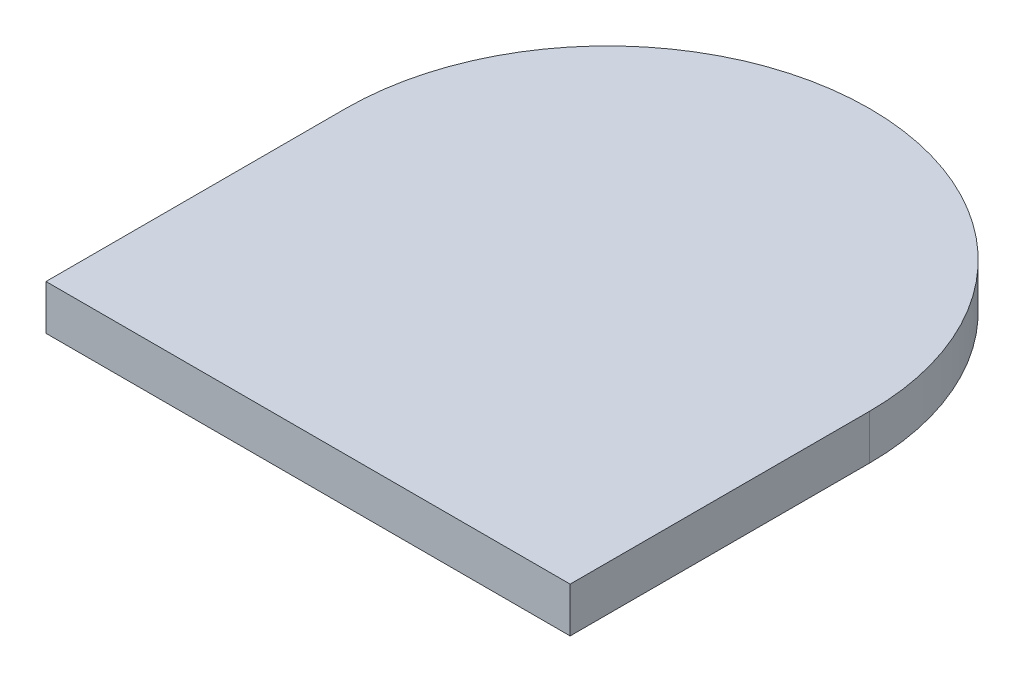
ISO-10303-21;
HEADER;
FILE_DESCRIPTION(('STEP AP214'),'2;1');
FILE_NAME('part.step','',(''),(''),'','','');
FILE_SCHEMA(('AUTOMOTIVE_DESIGN { 1 0 10303 214 1 1 1 1 }'));
ENDSEC;
DATA;
#1=APPLICATION_CONTEXT('core data for automotive mechanical design processes');
#2=APPLICATION_PROTOCOL_DEFINITION('international standard','automotive_design',2000,#1);
#3=PRODUCT_CONTEXT('',#1,'mechanical');
#4=PRODUCT('Part','Part','',(#3));
#5=PRODUCT_RELATED_PRODUCT_CATEGORY('part','',(#4));
#6=PRODUCT_DEFINITION_FORMATION('','',#4);
#7=PRODUCT_DEFINITION_CONTEXT('part definition',#1,'design');
#8=PRODUCT_DEFINITION('design','',#6,#7);
#9=PRODUCT_DEFINITION_SHAPE('','',#8);
#10=(LENGTH_UNIT() NAMED_UNIT(*) SI_UNIT(.MILLI.,.METRE.));
#11=(NAMED_UNIT(*) PLANE_ANGLE_UNIT() SI_UNIT($,.RADIAN.));
#12=(NAMED_UNIT(*) SI_UNIT($,.STERADIAN.) SOLID_ANGLE_UNIT());
#13=UNCERTAINTY_MEASURE_WITH_UNIT(LENGTH_MEASURE(1.E-05),#10,'distance_accuracy_value','');
#14=(GEOMETRIC_REPRESENTATION_CONTEXT(3) GLOBAL_UNCERTAINTY_ASSIGNED_CONTEXT((#13)) GLOBAL_UNIT_ASSIGNED_CONTEXT((#10,
#11,#12)) REPRESENTATION_CONTEXT('',''));
#15=CARTESIAN_POINT('',(0.,0.,0.));
#16=DIRECTION('',(0.,0.,1.));
#17=DIRECTION('',(1.,0.,0.));
#18=AXIS2_PLACEMENT_3D('',#15,#16,#17);
#19=CARTESIAN_POINT('',(0.,3.,0.));
#20=DIRECTION('',(0.,-1.,0.));
#21=DIRECTION('',(0.,0.,-1.));
#22=AXIS2_PLACEMENT_3D('',#19,#20,#21);
#23=CYLINDRICAL_SURFACE('',#22,17.5);
#24=CARTESIAN_POINT('',(0.,0.,0.));
#25=DIRECTION('',(0.,1.,0.));
#26=DIRECTION('',(0.,0.,1.));
#27=AXIS2_PLACEMENT_3D('',#24,#25,#26);
#28=CIRCLE('',#27,17.5);
#29=CARTESIAN_POINT('',(17.5,0.,0.));
#30=VERTEX_POINT('',#29);
#31=CARTESIAN_POINT('',(-17.5,0.,0.));
#32=VERTEX_POINT('',#31);
#33=EDGE_CURVE('E111',#30,#32,#28,.T.);
#34=ORIENTED_EDGE('',*,*,#33,.T.);
#35=DIRECTION('',(0.,-1.,0.));
#36=VECTOR('',#35,1.);
#37=CARTESIAN_POINT('',(-17.5,3.,0.));
#38=LINE('',#37,#36);
#39=CARTESIAN_POINT('',(-17.5,3.,0.));
#40=VERTEX_POINT('',#39);
#41=EDGE_CURVE('E11',#40,#32,#38,.T.);
#42=ORIENTED_EDGE('',*,*,#41,.F.);
#43=CARTESIAN_POINT('',(0.,3.,0.));
#44=DIRECTION('',(0.,1.,0.));
#45=DIRECTION('',(0.,0.,1.));
#46=AXIS2_PLACEMENT_3D('',#43,#44,#45);
#47=CIRCLE('',#46,17.5);
#48=CARTESIAN_POINT('',(17.5,3.,0.));
#49=VERTEX_POINT('',#48);
#50=EDGE_CURVE('E95',#49,#40,#47,.T.);
#51=ORIENTED_EDGE('',*,*,#50,.F.);
#52=DIRECTION('',(0.,-1.,0.));
#53=VECTOR('',#52,1.);
#54=CARTESIAN_POINT('',(17.5,3.,0.));
#55=LINE('',#54,#53);
#56=EDGE_CURVE('E107',#49,#30,#55,.T.);
#57=ORIENTED_EDGE('',*,*,#56,.T.);
#58=EDGE_LOOP('',(#34,#42,#51,#57));
#59=FACE_BOUND('',#58,.T.);
#60=ADVANCED_FACE('F43',(#59),#23,.T.);
#61=CARTESIAN_POINT('',(-17.5,3.,0.));
#62=DIRECTION('',(1.,0.,0.));
#63=DIRECTION('',(0.,0.,-1.));
#64=AXIS2_PLACEMENT_3D('',#61,#62,#63);
#65=PLANE('',#64);
#66=DIRECTION('',(0.,0.,1.));
#67=VECTOR('',#66,1.);
#68=CARTESIAN_POINT('',(-17.5,0.,0.));
#69=LINE('',#68,#67);
#70=CARTESIAN_POINT('',(-17.5,0.,20.));
#71=VERTEX_POINT('',#70);
#72=EDGE_CURVE('E100',#32,#71,#69,.T.);
#73=ORIENTED_EDGE('',*,*,#72,.T.);
#74=DIRECTION('',(0.,-1.,0.));
#75=VECTOR('',#74,1.);
#76=CARTESIAN_POINT('',(-17.5,3.,20.));
#77=LINE('',#76,#75);
#78=CARTESIAN_POINT('',(-17.5,3.,20.));
#79=VERTEX_POINT('',#78);
#80=EDGE_CURVE('E52',#79,#71,#77,.T.);
#81=ORIENTED_EDGE('',*,*,#80,.F.);
#82=DIRECTION('',(0.,0.,1.));
#83=VECTOR('',#82,1.);
#84=CARTESIAN_POINT('',(-17.5,3.,0.));
#85=LINE('',#84,#83);
#86=EDGE_CURVE('E90',#40,#79,#85,.T.);
#87=ORIENTED_EDGE('',*,*,#86,.F.);
#88=ORIENTED_EDGE('',*,*,#41,.T.);
#89=EDGE_LOOP('',(#73,#81,#87,#88));
#90=FACE_BOUND('',#89,.T.);
#91=ADVANCED_FACE('F99',(#90),#65,.F.);
#92=CARTESIAN_POINT('',(-17.5,3.,20.));
#93=DIRECTION('',(0.,0.,-1.));
#94=DIRECTION('',(-1.,0.,0.));
#95=AXIS2_PLACEMENT_3D('',#92,#93,#94);
#96=PLANE('',#95);
#97=DIRECTION('',(1.,0.,0.));
#98=VECTOR('',#97,1.);
#99=CARTESIAN_POINT('',(-17.5,0.,20.));
#100=LINE('',#99,#98);
#101=CARTESIAN_POINT('',(17.5,0.,20.));
#102=VERTEX_POINT('',#101);
#103=EDGE_CURVE('E77',#71,#102,#100,.T.);
#104=ORIENTED_EDGE('',*,*,#103,.T.);
#105=DIRECTION('',(0.,-1.,0.));
#106=VECTOR('',#105,1.);
#107=CARTESIAN_POINT('',(17.5,3.,20.));
#108=LINE('',#107,#106);
#109=CARTESIAN_POINT('',(17.5,3.,20.));
#110=VERTEX_POINT('',#109);
#111=EDGE_CURVE('E102',#110,#102,#108,.T.);
#112=ORIENTED_EDGE('',*,*,#111,.F.);
#113=DIRECTION('',(1.,0.,0.));
#114=VECTOR('',#113,1.);
#115=CARTESIAN_POINT('',(-17.5,3.,20.));
#116=LINE('',#115,#114);
#117=EDGE_CURVE('E93',#79,#110,#116,.T.);
#118=ORIENTED_EDGE('',*,*,#117,.F.);
#119=ORIENTED_EDGE('',*,*,#80,.T.);
#120=EDGE_LOOP('',(#104,#112,#118,#119));
#121=FACE_BOUND('',#120,.T.);
#122=ADVANCED_FACE('F103',(#121),#96,.F.);
#123=CARTESIAN_POINT('',(17.5,3.,20.));
#124=DIRECTION('',(-1.,0.,0.));
#125=DIRECTION('',(0.,0.,1.));
#126=AXIS2_PLACEMENT_3D('',#123,#124,#125);
#127=PLANE('',#126);
#128=DIRECTION('',(0.,0.,-1.));
#129=VECTOR('',#128,1.);
#130=CARTESIAN_POINT('',(17.5,0.,20.));
#131=LINE('',#130,#129);
#132=EDGE_CURVE('E83',#102,#30,#131,.T.);
#133=ORIENTED_EDGE('',*,*,#132,.T.);
#134=ORIENTED_EDGE('',*,*,#56,.F.);
#135=DIRECTION('',(0.,0.,-1.));
#136=VECTOR('',#135,1.);
#137=CARTESIAN_POINT('',(17.5,3.,20.));
#138=LINE('',#137,#136);
#139=EDGE_CURVE('E60',#110,#49,#138,.T.);
#140=ORIENTED_EDGE('',*,*,#139,.F.);
#141=ORIENTED_EDGE('',*,*,#111,.T.);
#142=EDGE_LOOP('',(#133,#134,#140,#141));
#143=FACE_BOUND('',#142,.T.);
#144=ADVANCED_FACE('F124',(#143),#127,.F.);
#145=CARTESIAN_POINT('',(0.,3.,0.));
#146=DIRECTION('',(0.,1.,0.));
#147=DIRECTION('',(0.,0.,1.));
#148=AXIS2_PLACEMENT_3D('',#145,#146,#147);
#149=PLANE('',#148);
#150=ORIENTED_EDGE('',*,*,#50,.T.);
#151=ORIENTED_EDGE('',*,*,#86,.T.);
#152=ORIENTED_EDGE('',*,*,#117,.T.);
#153=ORIENTED_EDGE('',*,*,#139,.T.);
#154=EDGE_LOOP('',(#150,#151,#152,#153));
#155=FACE_BOUND('',#154,.T.);
#156=ADVANCED_FACE('F91',(#155),#149,.T.);
#157=CARTESIAN_POINT('',(0.,0.,0.));
#158=DIRECTION('',(0.,1.,0.));
#159=DIRECTION('',(0.,0.,1.));
#160=AXIS2_PLACEMENT_3D('',#157,#158,#159);
#161=PLANE('',#160);
#162=ORIENTED_EDGE('',*,*,#33,.F.);
#163=ORIENTED_EDGE('',*,*,#132,.F.);
#164=ORIENTED_EDGE('',*,*,#103,.F.);
#165=ORIENTED_EDGE('',*,*,#72,.F.);
#166=EDGE_LOOP('',(#162,#163,#164,#165));
#167=FACE_BOUND('',#166,.T.);
#168=ADVANCED_FACE('F127',(#167),#161,.F.);
#169=CLOSED_SHELL('',(#60,#91,#122,#144,#156,#168));
#170=MANIFOLD_SOLID_BREP('B2',#169);
#171=ADVANCED_BREP_SHAPE_REPRESENTATION('',(#18,#170),#14);
#172=SHAPE_DEFINITION_REPRESENTATION(#9,#171);
ENDSEC;
END-ISO-10303-21;
